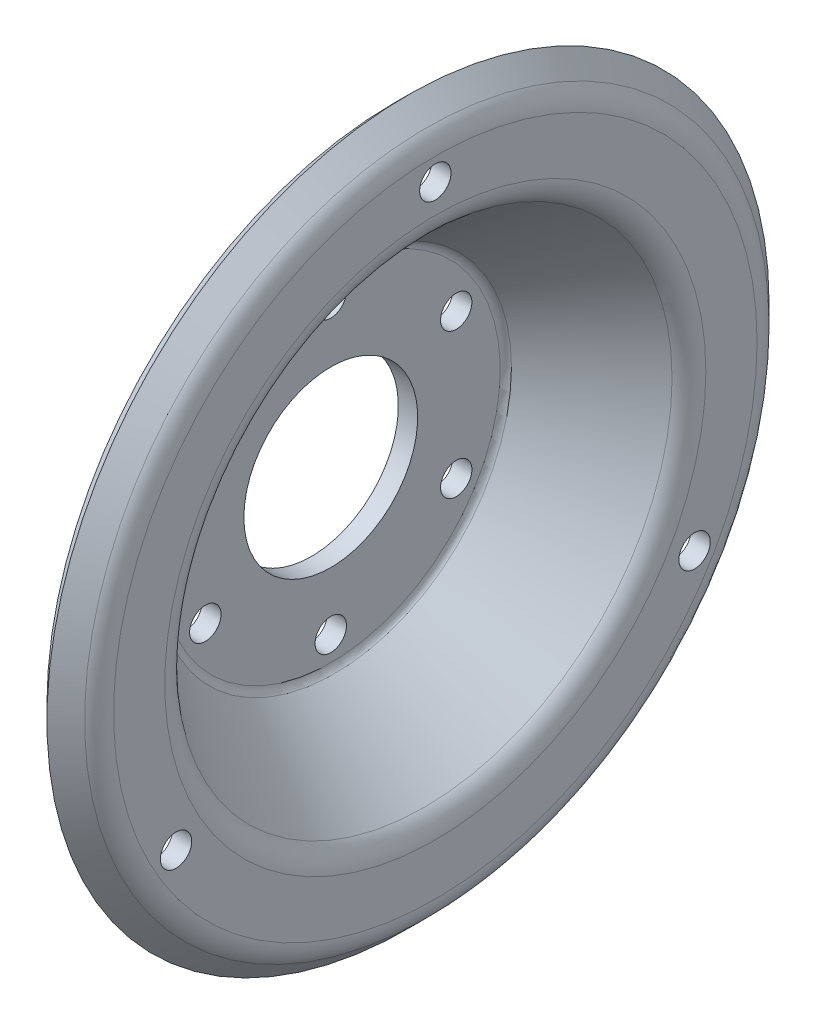
ISO-10303-21;
HEADER;
FILE_DESCRIPTION(('STEP AP214'),'2;1');
FILE_NAME('part.step','',(''),(''),'','','');
FILE_SCHEMA(('AUTOMOTIVE_DESIGN { 1 0 10303 214 1 1 1 1 }'));
ENDSEC;
DATA;
#1=APPLICATION_CONTEXT('core data for automotive mechanical design processes');
#2=APPLICATION_PROTOCOL_DEFINITION('international standard','automotive_design',2000,#1);
#3=PRODUCT_CONTEXT('',#1,'mechanical');
#4=PRODUCT('Part','Part','',(#3));
#5=PRODUCT_RELATED_PRODUCT_CATEGORY('part','',(#4));
#6=PRODUCT_DEFINITION_FORMATION('','',#4);
#7=PRODUCT_DEFINITION_CONTEXT('part definition',#1,'design');
#8=PRODUCT_DEFINITION('design','',#6,#7);
#9=PRODUCT_DEFINITION_SHAPE('','',#8);
#10=(LENGTH_UNIT() NAMED_UNIT(*) SI_UNIT(.MILLI.,.METRE.));
#11=(NAMED_UNIT(*) PLANE_ANGLE_UNIT() SI_UNIT($,.RADIAN.));
#12=(NAMED_UNIT(*) SI_UNIT($,.STERADIAN.) SOLID_ANGLE_UNIT());
#13=UNCERTAINTY_MEASURE_WITH_UNIT(LENGTH_MEASURE(1.E-05),#10,'distance_accuracy_value','');
#14=(GEOMETRIC_REPRESENTATION_CONTEXT(3) GLOBAL_UNCERTAINTY_ASSIGNED_CONTEXT((#13)) GLOBAL_UNIT_ASSIGNED_CONTEXT((#10,
#11,#12)) REPRESENTATION_CONTEXT('',''));
#15=CARTESIAN_POINT('',(0.,0.,0.));
#16=DIRECTION('',(0.,0.,1.));
#17=DIRECTION('',(1.,0.,0.));
#18=AXIS2_PLACEMENT_3D('',#15,#16,#17);
#19=CARTESIAN_POINT('',(4.76249999997251,0.,0.));
#20=DIRECTION('',(1.,0.,0.));
#21=DIRECTION('',(0.,1.,0.));
#22=AXIS2_PLACEMENT_3D('',#19,#20,#21);
#23=TOROIDAL_SURFACE('',#22,27.851971337,1.58749999995849);
#24=CARTESIAN_POINT('',(3.17500000001402,0.,0.));
#25=DIRECTION('',(1.,0.,0.));
#26=DIRECTION('',(0.,1.,0.));
#27=AXIS2_PLACEMENT_3D('',#24,#25,#26);
#28=CIRCLE('',#27,27.8519713231419);
#29=CARTESIAN_POINT('',(3.17500000001402,27.8519713231419,0.));
#30=VERTEX_POINT('',#29);
#31=EDGE_CURVE('E20',#30,#30,#28,.T.);
#32=ORIENTED_EDGE('',*,*,#31,.F.);
#33=EDGE_LOOP('',(#32));
#34=FACE_BOUND('',#33,.T.);
#35=CARTESIAN_POINT('',(3.77992162600005,0.,0.));
#36=DIRECTION('',(1.,0.,0.));
#37=DIRECTION('',(0.,0.,-1.));
#38=AXIS2_PLACEMENT_3D('',#35,#36,#37);
#39=CIRCLE('',#38,29.098845825);
#40=CARTESIAN_POINT('',(3.779921626,0.,-29.098845825));
#41=VERTEX_POINT('',#40);
#42=EDGE_CURVE('E90',#41,#41,#39,.F.);
#43=ORIENTED_EDGE('',*,*,#42,.F.);
#44=EDGE_LOOP('',(#43));
#45=FACE_BOUND('',#44,.T.);
#46=ADVANCED_FACE('F16',(#34,#45),#23,.F.);
#47=CARTESIAN_POINT('',(3.175,-28.186219608,28.186194993));
#48=DIRECTION('',(1.,0.,0.));
#49=DIRECTION('',(0.,0.,-1.));
#50=AXIS2_PLACEMENT_3D('',#47,#48,#49);
#51=PLANE('',#50);
#52=CARTESIAN_POINT('',(3.175,11.90625,20.622229928));
#53=DIRECTION('',(-1.,0.,0.));
#54=DIRECTION('',(0.,0.,1.));
#55=AXIS2_PLACEMENT_3D('',#52,#53,#54);
#56=CIRCLE('',#55,2.5781);
#57=CARTESIAN_POINT('',(3.175,11.90625,23.200329928));
#58=VERTEX_POINT('',#57);
#59=EDGE_CURVE('E89',#58,#58,#56,.F.);
#60=ORIENTED_EDGE('',*,*,#59,.F.);
#61=EDGE_LOOP('',(#60));
#62=FACE_BOUND('',#61,.T.);
#63=CARTESIAN_POINT('',(3.175,-11.90625,20.622229928));
#64=DIRECTION('',(-1.,0.,0.));
#65=DIRECTION('',(0.,0.,1.));
#66=AXIS2_PLACEMENT_3D('',#63,#64,#65);
#67=CIRCLE('',#66,2.5781);
#68=CARTESIAN_POINT('',(3.175,-11.90625,23.200329928));
#69=VERTEX_POINT('',#68);
#70=EDGE_CURVE('E164',#69,#69,#67,.F.);
#71=ORIENTED_EDGE('',*,*,#70,.F.);
#72=EDGE_LOOP('',(#71));
#73=FACE_BOUND('',#72,.T.);
#74=CARTESIAN_POINT('',(3.175,-23.8125,0.));
#75=DIRECTION('',(-1.,0.,0.));
#76=DIRECTION('',(0.,0.,1.));
#77=AXIS2_PLACEMENT_3D('',#74,#75,#76);
#78=CIRCLE('',#77,2.5781);
#79=CARTESIAN_POINT('',(3.175,-23.8125,2.5781));
#80=VERTEX_POINT('',#79);
#81=EDGE_CURVE('E167',#80,#80,#78,.F.);
#82=ORIENTED_EDGE('',*,*,#81,.F.);
#83=EDGE_LOOP('',(#82));
#84=FACE_BOUND('',#83,.T.);
#85=CARTESIAN_POINT('',(3.175,-11.90625,-20.622229928));
#86=DIRECTION('',(-1.,0.,0.));
#87=DIRECTION('',(0.,0.,1.));
#88=AXIS2_PLACEMENT_3D('',#85,#86,#87);
#89=CIRCLE('',#88,2.5781);
#90=CARTESIAN_POINT('',(3.175,-11.90625,-18.044129928));
#91=VERTEX_POINT('',#90);
#92=EDGE_CURVE('E170',#91,#91,#89,.F.);
#93=ORIENTED_EDGE('',*,*,#92,.F.);
#94=EDGE_LOOP('',(#93));
#95=FACE_BOUND('',#94,.T.);
#96=CARTESIAN_POINT('',(3.175,11.90625,-20.622229928));
#97=DIRECTION('',(-1.,0.,0.));
#98=DIRECTION('',(0.,0.,1.));
#99=AXIS2_PLACEMENT_3D('',#96,#97,#98);
#100=CIRCLE('',#99,2.5781);
#101=CARTESIAN_POINT('',(3.175,11.90625,-18.044129928));
#102=VERTEX_POINT('',#101);
#103=EDGE_CURVE('E173',#102,#102,#100,.F.);
#104=ORIENTED_EDGE('',*,*,#103,.F.);
#105=EDGE_LOOP('',(#104));
#106=FACE_BOUND('',#105,.T.);
#107=CARTESIAN_POINT('',(3.175,0.,0.));
#108=DIRECTION('',(-1.,0.,0.));
#109=DIRECTION('',(0.,0.,1.));
#110=AXIS2_PLACEMENT_3D('',#107,#108,#109);
#111=CIRCLE('',#110,14.2875);
#112=CARTESIAN_POINT('',(3.175,0.,14.2875));
#113=VERTEX_POINT('',#112);
#114=EDGE_CURVE('E176',#113,#113,#111,.F.);
#115=ORIENTED_EDGE('',*,*,#114,.F.);
#116=EDGE_LOOP('',(#115));
#117=FACE_BOUND('',#116,.T.);
#118=CARTESIAN_POINT('',(3.175,23.8125,0.));
#119=DIRECTION('',(-1.,0.,0.));
#120=DIRECTION('',(0.,0.,1.));
#121=AXIS2_PLACEMENT_3D('',#118,#119,#120);
#122=CIRCLE('',#121,2.5781);
#123=CARTESIAN_POINT('',(3.175,23.8125,2.5781));
#124=VERTEX_POINT('',#123);
#125=EDGE_CURVE('E92',#124,#124,#122,.F.);
#126=ORIENTED_EDGE('',*,*,#125,.F.);
#127=EDGE_LOOP('',(#126));
#128=FACE_BOUND('',#127,.T.);
#129=ORIENTED_EDGE('',*,*,#31,.T.);
#130=EDGE_LOOP('',(#129));
#131=FACE_BOUND('',#130,.T.);
#132=ADVANCED_FACE('F184',(#62,#73,#84,#95,#106,#117,#128,#131),#51,.T.);
#133=CARTESIAN_POINT('',(18.964466045,0.,0.));
#134=DIRECTION('',(-1.,0.,0.));
#135=DIRECTION('',(0.,0.,1.));
#136=AXIS2_PLACEMENT_3D('',#133,#134,#135);
#137=CONICAL_SURFACE('',#136,56.258903955,0.785398163397447);
#138=CARTESIAN_POINT('',(18.964466045,0.,0.));
#139=DIRECTION('',(1.,0.,0.));
#140=DIRECTION('',(0.,0.,-1.));
#141=AXIS2_PLACEMENT_3D('',#138,#139,#140);
#142=CIRCLE('',#141,56.258903955);
#143=CARTESIAN_POINT('',(18.964466045,0.,-56.258903955));
#144=VERTEX_POINT('',#143);
#145=EDGE_CURVE('E83',#144,#144,#142,.T.);
#146=ORIENTED_EDGE('',*,*,#145,.F.);
#147=EDGE_LOOP('',(#146));
#148=FACE_BOUND('',#147,.T.);
#149=CARTESIAN_POINT('',(15.869241939,0.,0.));
#150=DIRECTION('',(1.,0.,0.));
#151=DIRECTION('',(0.,0.,-1.));
#152=AXIS2_PLACEMENT_3D('',#149,#150,#151);
#153=CIRCLE('',#152,59.354128061);
#154=CARTESIAN_POINT('',(15.869241939,0.,-59.354128061));
#155=VERTEX_POINT('',#154);
#156=EDGE_CURVE('E86',#155,#155,#153,.T.);
#157=ORIENTED_EDGE('',*,*,#156,.T.);
#158=EDGE_LOOP('',(#157));
#159=FACE_BOUND('',#158,.T.);
#160=ADVANCED_FACE('F187',(#148,#159),#137,.T.);
#161=CARTESIAN_POINT('',(3.779921626,0.,0.));
#162=DIRECTION('',(1.,0.,0.));
#163=DIRECTION('',(0.,1.,0.));
#164=AXIS2_PLACEMENT_3D('',#161,#162,#163);
#165=CONICAL_SURFACE('',#164,29.098845825,0.667401340824713);
#166=ORIENTED_EDGE('',*,*,#42,.T.);
#167=EDGE_LOOP('',(#166));
#168=FACE_BOUND('',#167,.T.);
#169=CARTESIAN_POINT('',(18.544605122,0.,0.));
#170=DIRECTION('',(-1.,0.,0.));
#171=DIRECTION('',(0.,0.,1.));
#172=AXIS2_PLACEMENT_3D('',#169,#170,#171);
#173=CIRCLE('',#172,40.733905199);
#174=CARTESIAN_POINT('',(18.544605122,0.,40.733905199));
#175=VERTEX_POINT('',#174);
#176=EDGE_CURVE('E79',#175,#175,#173,.T.);
#177=ORIENTED_EDGE('',*,*,#176,.F.);
#178=EDGE_LOOP('',(#177));
#179=FACE_BOUND('',#178,.T.);
#180=ADVANCED_FACE('F198',(#168,#179),#165,.F.);
#181=CARTESIAN_POINT('',(3.175,23.8125,0.));
#182=DIRECTION('',(-1.,0.,0.));
#183=DIRECTION('',(0.,0.,1.));
#184=AXIS2_PLACEMENT_3D('',#181,#182,#183);
#185=CYLINDRICAL_SURFACE('',#184,2.5781);
#186=ORIENTED_EDGE('',*,*,#125,.T.);
#187=EDGE_LOOP('',(#186));
#188=FACE_BOUND('',#187,.T.);
#189=CARTESIAN_POINT('',(0.,23.8125,0.));
#190=DIRECTION('',(-1.,0.,0.));
#191=DIRECTION('',(0.,0.,1.));
#192=AXIS2_PLACEMENT_3D('',#189,#190,#191);
#193=CIRCLE('',#192,2.5781);
#194=CARTESIAN_POINT('',(0.,23.8125,2.5781));
#195=VERTEX_POINT('',#194);
#196=EDGE_CURVE('E82',#195,#195,#193,.F.);
#197=ORIENTED_EDGE('',*,*,#196,.F.);
#198=EDGE_LOOP('',(#197));
#199=FACE_BOUND('',#198,.T.);
#200=ADVANCED_FACE('F181',(#188,#199),#185,.F.);
#201=CARTESIAN_POINT('',(3.175,0.,0.));
#202=DIRECTION('',(-1.,0.,0.));
#203=DIRECTION('',(0.,0.,1.));
#204=AXIS2_PLACEMENT_3D('',#201,#202,#203);
#205=CYLINDRICAL_SURFACE('',#204,14.2875);
#206=ORIENTED_EDGE('',*,*,#114,.T.);
#207=EDGE_LOOP('',(#206));
#208=FACE_BOUND('',#207,.T.);
#209=CARTESIAN_POINT('',(0.,0.,0.));
#210=DIRECTION('',(-1.,0.,0.));
#211=DIRECTION('',(0.,0.,1.));
#212=AXIS2_PLACEMENT_3D('',#209,#210,#211);
#213=CIRCLE('',#212,14.2875);
#214=CARTESIAN_POINT('',(0.,0.,14.2875));
#215=VERTEX_POINT('',#214);
#216=EDGE_CURVE('E157',#215,#215,#213,.F.);
#217=ORIENTED_EDGE('',*,*,#216,.F.);
#218=EDGE_LOOP('',(#217));
#219=FACE_BOUND('',#218,.T.);
#220=ADVANCED_FACE('F286',(#208,#219),#205,.F.);
#221=CARTESIAN_POINT('',(3.175,11.90625,-20.622229928));
#222=DIRECTION('',(-1.,0.,0.));
#223=DIRECTION('',(0.,0.,1.));
#224=AXIS2_PLACEMENT_3D('',#221,#222,#223);
#225=CYLINDRICAL_SURFACE('',#224,2.5781);
#226=ORIENTED_EDGE('',*,*,#103,.T.);
#227=EDGE_LOOP('',(#226));
#228=FACE_BOUND('',#227,.T.);
#229=CARTESIAN_POINT('',(0.,11.90625,-20.622229928));
#230=DIRECTION('',(-1.,0.,0.));
#231=DIRECTION('',(0.,0.,1.));
#232=AXIS2_PLACEMENT_3D('',#229,#230,#231);
#233=CIRCLE('',#232,2.5781);
#234=CARTESIAN_POINT('',(0.,11.90625,-18.044129928));
#235=VERTEX_POINT('',#234);
#236=EDGE_CURVE('E154',#235,#235,#233,.F.);
#237=ORIENTED_EDGE('',*,*,#236,.F.);
#238=EDGE_LOOP('',(#237));
#239=FACE_BOUND('',#238,.T.);
#240=ADVANCED_FACE('F282',(#228,#239),#225,.F.);
#241=CARTESIAN_POINT('',(3.175,-11.90625,-20.622229928));
#242=DIRECTION('',(-1.,0.,0.));
#243=DIRECTION('',(0.,0.,1.));
#244=AXIS2_PLACEMENT_3D('',#241,#242,#243);
#245=CYLINDRICAL_SURFACE('',#244,2.5781);
#246=ORIENTED_EDGE('',*,*,#92,.T.);
#247=EDGE_LOOP('',(#246));
#248=FACE_BOUND('',#247,.T.);
#249=CARTESIAN_POINT('',(0.,-11.90625,-20.622229928));
#250=DIRECTION('',(-1.,0.,0.));
#251=DIRECTION('',(0.,0.,1.));
#252=AXIS2_PLACEMENT_3D('',#249,#250,#251);
#253=CIRCLE('',#252,2.5781);
#254=CARTESIAN_POINT('',(0.,-11.90625,-18.044129928));
#255=VERTEX_POINT('',#254);
#256=EDGE_CURVE('E151',#255,#255,#253,.F.);
#257=ORIENTED_EDGE('',*,*,#256,.F.);
#258=EDGE_LOOP('',(#257));
#259=FACE_BOUND('',#258,.T.);
#260=ADVANCED_FACE('F278',(#248,#259),#245,.F.);
#261=CARTESIAN_POINT('',(3.175,-23.8125,0.));
#262=DIRECTION('',(-1.,0.,0.));
#263=DIRECTION('',(0.,0.,1.));
#264=AXIS2_PLACEMENT_3D('',#261,#262,#263);
#265=CYLINDRICAL_SURFACE('',#264,2.5781);
#266=ORIENTED_EDGE('',*,*,#81,.T.);
#267=EDGE_LOOP('',(#266));
#268=FACE_BOUND('',#267,.T.);
#269=CARTESIAN_POINT('',(0.,-23.8125,0.));
#270=DIRECTION('',(-1.,0.,0.));
#271=DIRECTION('',(0.,0.,1.));
#272=AXIS2_PLACEMENT_3D('',#269,#270,#271);
#273=CIRCLE('',#272,2.5781);
#274=CARTESIAN_POINT('',(0.,-23.8125,2.5781));
#275=VERTEX_POINT('',#274);
#276=EDGE_CURVE('E148',#275,#275,#273,.F.);
#277=ORIENTED_EDGE('',*,*,#276,.F.);
#278=EDGE_LOOP('',(#277));
#279=FACE_BOUND('',#278,.T.);
#280=ADVANCED_FACE('F274',(#268,#279),#265,.F.);
#281=CARTESIAN_POINT('',(3.175,-11.90625,20.622229928));
#282=DIRECTION('',(-1.,0.,0.));
#283=DIRECTION('',(0.,0.,1.));
#284=AXIS2_PLACEMENT_3D('',#281,#282,#283);
#285=CYLINDRICAL_SURFACE('',#284,2.5781);
#286=ORIENTED_EDGE('',*,*,#70,.T.);
#287=EDGE_LOOP('',(#286));
#288=FACE_BOUND('',#287,.T.);
#289=CARTESIAN_POINT('',(0.,-11.90625,20.622229928));
#290=DIRECTION('',(-1.,0.,0.));
#291=DIRECTION('',(0.,0.,1.));
#292=AXIS2_PLACEMENT_3D('',#289,#290,#291);
#293=CIRCLE('',#292,2.5781);
#294=CARTESIAN_POINT('',(0.,-11.90625,23.200329928));
#295=VERTEX_POINT('',#294);
#296=EDGE_CURVE('E145',#295,#295,#293,.F.);
#297=ORIENTED_EDGE('',*,*,#296,.F.);
#298=EDGE_LOOP('',(#297));
#299=FACE_BOUND('',#298,.T.);
#300=ADVANCED_FACE('F270',(#288,#299),#285,.F.);
#301=CARTESIAN_POINT('',(3.175,11.90625,20.622229928));
#302=DIRECTION('',(-1.,0.,0.));
#303=DIRECTION('',(0.,0.,1.));
#304=AXIS2_PLACEMENT_3D('',#301,#302,#303);
#305=CYLINDRICAL_SURFACE('',#304,2.5781);
#306=ORIENTED_EDGE('',*,*,#59,.T.);
#307=EDGE_LOOP('',(#306));
#308=FACE_BOUND('',#307,.T.);
#309=CARTESIAN_POINT('',(0.,11.90625,20.622229928));
#310=DIRECTION('',(-1.,0.,0.));
#311=DIRECTION('',(0.,0.,1.));
#312=AXIS2_PLACEMENT_3D('',#309,#310,#311);
#313=CIRCLE('',#312,2.5781);
#314=CARTESIAN_POINT('',(0.,11.90625,23.200329928));
#315=VERTEX_POINT('',#314);
#316=EDGE_CURVE('E78',#315,#315,#313,.F.);
#317=ORIENTED_EDGE('',*,*,#316,.F.);
#318=EDGE_LOOP('',(#317));
#319=FACE_BOUND('',#318,.T.);
#320=ADVANCED_FACE('F226',(#308,#319),#305,.F.);
#321=CARTESIAN_POINT('',(13.624177909,0.,0.));
#322=DIRECTION('',(1.,0.,0.));
#323=DIRECTION('',(0.,0.,-1.));
#324=AXIS2_PLACEMENT_3D('',#321,#322,#323);
#325=CONICAL_SURFACE('',#324,57.10906403,0.785398163620155);
#326=CARTESIAN_POINT('',(13.6241779090001,0.,0.));
#327=DIRECTION('',(-1.,0.,0.));
#328=DIRECTION('',(0.,0.,1.));
#329=AXIS2_PLACEMENT_3D('',#326,#327,#328);
#330=CIRCLE('',#329,57.10906403);
#331=CARTESIAN_POINT('',(13.624177909,0.,57.10906403));
#332=VERTEX_POINT('',#331);
#333=EDGE_CURVE('E74',#332,#332,#330,.T.);
#334=ORIENTED_EDGE('',*,*,#333,.F.);
#335=EDGE_LOOP('',(#334));
#336=FACE_BOUND('',#335,.T.);
#337=ORIENTED_EDGE('',*,*,#156,.F.);
#338=EDGE_LOOP('',(#337));
#339=FACE_BOUND('',#338,.T.);
#340=ADVANCED_FACE('F219',(#336,#339),#325,.T.);
#341=CARTESIAN_POINT('',(15.596869999,0.,0.));
#342=DIRECTION('',(1.,0.,0.));
#343=DIRECTION('',(0.,0.,-1.));
#344=AXIS2_PLACEMENT_3D('',#341,#342,#343);
#345=TOROIDAL_SURFACE('',#344,52.891307909,4.76250000092363);
#346=ORIENTED_EDGE('',*,*,#145,.T.);
#347=EDGE_LOOP('',(#346));
#348=FACE_BOUND('',#347,.T.);
#349=CARTESIAN_POINT('',(20.3593699999236,0.,0.));
#350=DIRECTION('',(1.,0.,0.));
#351=DIRECTION('',(0.,0.,-1.));
#352=AXIS2_PLACEMENT_3D('',#349,#350,#351);
#353=CIRCLE('',#352,52.8913078828568);
#354=CARTESIAN_POINT('',(20.3593699999236,0.,-52.8913078828568));
#355=VERTEX_POINT('',#354);
#356=EDGE_CURVE('E77',#355,#355,#353,.T.);
#357=ORIENTED_EDGE('',*,*,#356,.F.);
#358=EDGE_LOOP('',(#357));
#359=FACE_BOUND('',#358,.T.);
#360=ADVANCED_FACE('F208',(#348,#359),#345,.T.);
#361=CARTESIAN_POINT('',(15.5968700000825,0.,0.));
#362=DIRECTION('',(1.,0.,0.));
#363=DIRECTION('',(0.,0.,-1.));
#364=AXIS2_PLACEMENT_3D('',#361,#362,#363);
#365=TOROIDAL_SURFACE('',#364,44.474528663,4.76249999987547);
#366=ORIENTED_EDGE('',*,*,#176,.T.);
#367=EDGE_LOOP('',(#366));
#368=FACE_BOUND('',#367,.T.);
#369=CARTESIAN_POINT('',(20.359369999958,0.,0.));
#370=DIRECTION('',(1.,0.,0.));
#371=DIRECTION('',(0.,0.,-1.));
#372=AXIS2_PLACEMENT_3D('',#369,#370,#371);
#373=CIRCLE('',#372,44.4745286949443);
#374=CARTESIAN_POINT('',(20.359369999958,0.,-44.4745286949443));
#375=VERTEX_POINT('',#374);
#376=EDGE_CURVE('E138',#375,#375,#373,.F.);
#377=ORIENTED_EDGE('',*,*,#376,.F.);
#378=EDGE_LOOP('',(#377));
#379=FACE_BOUND('',#378,.T.);
#380=ADVANCED_FACE('F204',(#368,#379),#365,.T.);
#381=CARTESIAN_POINT('',(0.,-28.186219608,-28.186194993));
#382=DIRECTION('',(-1.,0.,0.));
#383=DIRECTION('',(0.,0.,1.));
#384=AXIS2_PLACEMENT_3D('',#381,#382,#383);
#385=PLANE('',#384);
#386=ORIENTED_EDGE('',*,*,#316,.T.);
#387=EDGE_LOOP('',(#386));
#388=FACE_BOUND('',#387,.T.);
#389=ORIENTED_EDGE('',*,*,#296,.T.);
#390=EDGE_LOOP('',(#389));
#391=FACE_BOUND('',#390,.T.);
#392=ORIENTED_EDGE('',*,*,#276,.T.);
#393=EDGE_LOOP('',(#392));
#394=FACE_BOUND('',#393,.T.);
#395=ORIENTED_EDGE('',*,*,#256,.T.);
#396=EDGE_LOOP('',(#395));
#397=FACE_BOUND('',#396,.T.);
#398=ORIENTED_EDGE('',*,*,#236,.T.);
#399=EDGE_LOOP('',(#398));
#400=FACE_BOUND('',#399,.T.);
#401=ORIENTED_EDGE('',*,*,#216,.T.);
#402=EDGE_LOOP('',(#401));
#403=FACE_BOUND('',#402,.T.);
#404=ORIENTED_EDGE('',*,*,#196,.T.);
#405=EDGE_LOOP('',(#404));
#406=FACE_BOUND('',#405,.T.);
#407=CARTESIAN_POINT('',(4.20392887168219E-11,0.,0.));
#408=DIRECTION('',(-1.,0.,0.));
#409=DIRECTION('',(0.,0.,1.));
#410=AXIS2_PLACEMENT_3D('',#407,#408,#409);
#411=CIRCLE('',#410,27.851971337);
#412=CARTESIAN_POINT('',(4.20392887168219E-11,0.,27.851971337));
#413=VERTEX_POINT('',#412);
#414=EDGE_CURVE('E53',#413,#413,#411,.F.);
#415=ORIENTED_EDGE('',*,*,#414,.F.);
#416=EDGE_LOOP('',(#415));
#417=FACE_BOUND('',#416,.T.);
#418=ADVANCED_FACE('F207',(#388,#391,#394,#397,#400,#403,#406,#417),#385,.T.);
#419=CARTESIAN_POINT('',(16.719402015,0.,0.));
#420=DIRECTION('',(-1.,0.,0.));
#421=DIRECTION('',(0.,-1.,0.));
#422=AXIS2_PLACEMENT_3D('',#419,#420,#421);
#423=CONICAL_SURFACE('',#422,54.013839924,0.785398163397448);
#424=ORIENTED_EDGE('',*,*,#333,.T.);
#425=EDGE_LOOP('',(#424));
#426=FACE_BOUND('',#425,.T.);
#427=CARTESIAN_POINT('',(16.719402015,0.,0.));
#428=DIRECTION('',(1.,0.,0.));
#429=DIRECTION('',(0.,0.,-1.));
#430=AXIS2_PLACEMENT_3D('',#427,#428,#429);
#431=CIRCLE('',#430,54.013839924);
#432=CARTESIAN_POINT('',(16.719402015,-2.42504933607236E-09,54.013839924));
#433=VERTEX_POINT('',#432);
#434=CARTESIAN_POINT('',(16.719402015,-5.53921187784534E-09,-54.013839924));
#435=VERTEX_POINT('',#434);
#436=EDGE_CURVE('E57',#433,#435,#431,.T.);
#437=ORIENTED_EDGE('',*,*,#436,.T.);
#438=CARTESIAN_POINT('',(16.719402015,0.,0.));
#439=DIRECTION('',(1.,0.,0.));
#440=DIRECTION('',(0.,0.,-1.));
#441=AXIS2_PLACEMENT_3D('',#438,#439,#440);
#442=CIRCLE('',#441,54.013839924);
#443=EDGE_CURVE('E44',#435,#433,#442,.T.);
#444=ORIENTED_EDGE('',*,*,#443,.T.);
#445=EDGE_LOOP('',(#437,#444));
#446=FACE_BOUND('',#445,.T.);
#447=ADVANCED_FACE('F62',(#426,#446),#423,.F.);
#448=CARTESIAN_POINT('',(20.35937,-53.526028222,53.526003604));
#449=DIRECTION('',(1.,0.,0.));
#450=DIRECTION('',(0.,0.,-1.));
#451=AXIS2_PLACEMENT_3D('',#448,#449,#450);
#452=PLANE('',#451);
#453=CARTESIAN_POINT('',(20.35937,-24.60625,-42.619275184));
#454=DIRECTION('',(1.,0.,0.));
#455=DIRECTION('',(0.,1.,0.));
#456=AXIS2_PLACEMENT_3D('',#453,#454,#455);
#457=CIRCLE('',#456,2.57810000000001);
#458=CARTESIAN_POINT('',(20.35937,-22.02815,-42.619275184));
#459=VERTEX_POINT('',#458);
#460=EDGE_CURVE('E73',#459,#459,#457,.T.);
#461=ORIENTED_EDGE('',*,*,#460,.F.);
#462=EDGE_LOOP('',(#461));
#463=FACE_BOUND('',#462,.T.);
#464=CARTESIAN_POINT('',(20.35937,-24.60625,42.619275184));
#465=DIRECTION('',(1.,0.,0.));
#466=DIRECTION('',(0.,1.,0.));
#467=AXIS2_PLACEMENT_3D('',#464,#465,#466);
#468=CIRCLE('',#467,2.5781);
#469=CARTESIAN_POINT('',(20.35937,-22.02815,42.619275184));
#470=VERTEX_POINT('',#469);
#471=EDGE_CURVE('E131',#470,#470,#468,.T.);
#472=ORIENTED_EDGE('',*,*,#471,.F.);
#473=EDGE_LOOP('',(#472));
#474=FACE_BOUND('',#473,.T.);
#475=CARTESIAN_POINT('',(20.35937,49.2125,0.));
#476=DIRECTION('',(1.,0.,0.));
#477=DIRECTION('',(0.,1.,0.));
#478=AXIS2_PLACEMENT_3D('',#475,#476,#477);
#479=CIRCLE('',#478,2.5781);
#480=CARTESIAN_POINT('',(20.35937,51.7906,0.));
#481=VERTEX_POINT('',#480);
#482=EDGE_CURVE('E60',#481,#481,#479,.T.);
#483=ORIENTED_EDGE('',*,*,#482,.F.);
#484=EDGE_LOOP('',(#483));
#485=FACE_BOUND('',#484,.T.);
#486=ORIENTED_EDGE('',*,*,#376,.T.);
#487=EDGE_LOOP('',(#486));
#488=FACE_BOUND('',#487,.T.);
#489=ORIENTED_EDGE('',*,*,#356,.T.);
#490=EDGE_LOOP('',(#489));
#491=FACE_BOUND('',#490,.T.);
#492=ADVANCED_FACE('F212',(#463,#474,#485,#488,#491),#452,.T.);
#493=CARTESIAN_POINT('',(4.76249999991748,0.,0.));
#494=DIRECTION('',(-1.,0.,0.));
#495=DIRECTION('',(0.,0.,1.));
#496=AXIS2_PLACEMENT_3D('',#493,#494,#495);
#497=TOROIDAL_SURFACE('',#496,27.851971337,4.76249999987544);
#498=ORIENTED_EDGE('',*,*,#414,.T.);
#499=EDGE_LOOP('',(#498));
#500=FACE_BOUND('',#499,.T.);
#501=CARTESIAN_POINT('',(1.81476487800003,0.,0.));
#502=DIRECTION('',(1.,0.,0.));
#503=DIRECTION('',(0.,0.,-1.));
#504=AXIS2_PLACEMENT_3D('',#501,#502,#503);
#505=CIRCLE('',#504,31.592594801);
#506=CARTESIAN_POINT('',(1.814764878,0.,-31.592594801));
#507=VERTEX_POINT('',#506);
#508=EDGE_CURVE('E70',#507,#507,#505,.F.);
#509=ORIENTED_EDGE('',*,*,#508,.T.);
#510=EDGE_LOOP('',(#509));
#511=FACE_BOUND('',#510,.T.);
#512=ADVANCED_FACE('F109',(#500,#511),#497,.T.);
#513=CARTESIAN_POINT('',(16.719402015,0.,54.013839924));
#514=CARTESIAN_POINT('',(16.719402015,108.027679849,54.013839924));
#515=CARTESIAN_POINT('',(16.719402015,108.027679849,-54.013839924));
#516=CARTESIAN_POINT('',(16.719402015,0.,-54.013839924));
#517=CARTESIAN_POINT('',(17.021094957,0.,53.712146983));
#518=CARTESIAN_POINT('',(17.021094957,107.424293966,53.712146983));
#519=CARTESIAN_POINT('',(17.021094957,107.424293966,-53.712146983));
#520=CARTESIAN_POINT('',(17.021094957,0.,-53.712146983));
#521=CARTESIAN_POINT('',(17.18437,0.,53.317966159));
#522=CARTESIAN_POINT('',(17.18437,106.635932317,53.317966159));
#523=CARTESIAN_POINT('',(17.18437,106.635932317,-53.317966159));
#524=CARTESIAN_POINT('',(17.18437,0.,-53.317966159));
#525=CARTESIAN_POINT('',(17.18437,0.,52.891307909));
#526=CARTESIAN_POINT('',(17.18437,105.782615818,52.891307909));
#527=CARTESIAN_POINT('',(17.18437,105.782615818,-52.891307909));
#528=CARTESIAN_POINT('',(17.18437,0.,-52.891307909));
#529=(BOUNDED_SURFACE() B_SPLINE_SURFACE(3,3,((#513,#514,#515,#516),(#517,#518,#519,#520),(#521,
#522,#523,#524),(#525,#526,#527,#528)),.UNSPECIFIED.,.F.,.F.,
.F.) B_SPLINE_SURFACE_WITH_KNOTS((4,4),(4,4),(0.,1.),(0.,1.),
.UNSPECIFIED.) GEOMETRIC_REPRESENTATION_ITEM() RATIONAL_B_SPLINE_SURFACE(((1.,0.333333333333333,
0.333333333333333,1.),(0.949253021674184,0.316417673891395,0.316417673891395,0.949253021674184),
(0.949253021674184,0.316417673891395,0.316417673891395,0.949253021674184),(1.,0.333333333333333,
0.333333333333333,1.))) REPRESENTATION_ITEM('') SURFACE());
#530=CARTESIAN_POINT('',(16.719402015,0.,-54.013839924));
#531=CARTESIAN_POINT('',(17.021094957,0.,-53.712146983));
#532=CARTESIAN_POINT('',(17.18437,0.,-53.317966159));
#533=CARTESIAN_POINT('',(17.18437,0.,-52.891307909));
#534=(BOUNDED_CURVE() B_SPLINE_CURVE(3,(#530,#531,#532,#533),.UNSPECIFIED.,.F.,
.F.) B_SPLINE_CURVE_WITH_KNOTS((4,4),(0.,1.),
.UNSPECIFIED.) CURVE() GEOMETRIC_REPRESENTATION_ITEM() RATIONAL_B_SPLINE_CURVE((1.,
0.949253021674184,0.949253021674184,1.)) REPRESENTATION_ITEM(''));
#535=CARTESIAN_POINT('',(17.18437,0.,-52.8913078985427));
#536=VERTEX_POINT('',#535);
#537=EDGE_CURVE('E50',#435,#536,#534,.T.);
#538=CARTESIAN_POINT('',(17.18437,0.,-52.891307909));
#539=CARTESIAN_POINT('',(17.18437,105.782615818,-52.891307909));
#540=CARTESIAN_POINT('',(17.18437,105.782615818,52.891307909));
#541=CARTESIAN_POINT('',(17.18437,0.,52.891307909));
#542=(BOUNDED_CURVE() B_SPLINE_CURVE(3,(#538,#539,#540,#541),.UNSPECIFIED.,.F.,
.F.) B_SPLINE_CURVE_WITH_KNOTS((4,4),(0.,1.),
.UNSPECIFIED.) CURVE() GEOMETRIC_REPRESENTATION_ITEM() RATIONAL_B_SPLINE_CURVE((0.999999999999998,
0.333333333333332,0.333333333333332,0.999999999999998)) REPRESENTATION_ITEM(''));
#543=CARTESIAN_POINT('',(17.18437,0.,52.8913078985427));
#544=VERTEX_POINT('',#543);
#545=EDGE_CURVE('E34',#544,#536,#542,.F.);
#546=CARTESIAN_POINT('',(16.719402015,0.,54.013839924));
#547=CARTESIAN_POINT('',(17.021094957,0.,53.712146983));
#548=CARTESIAN_POINT('',(17.18437,0.,53.317966159));
#549=CARTESIAN_POINT('',(17.18437,0.,52.891307909));
#550=(BOUNDED_CURVE() B_SPLINE_CURVE(3,(#546,#547,#548,#549),.UNSPECIFIED.,.F.,
.F.) B_SPLINE_CURVE_WITH_KNOTS((4,4),(0.,1.),
.UNSPECIFIED.) CURVE() GEOMETRIC_REPRESENTATION_ITEM() RATIONAL_B_SPLINE_CURVE((1.,
0.949253021674184,0.949253021674184,1.)) REPRESENTATION_ITEM(''));
#551=EDGE_CURVE('E52',#544,#433,#550,.F.);
#552=ORIENTED_EDGE('',*,*,#537,.T.);
#553=ORIENTED_EDGE('',*,*,#545,.F.);
#554=ORIENTED_EDGE('',*,*,#551,.T.);
#555=ORIENTED_EDGE('',*,*,#443,.F.);
#556=EDGE_LOOP('',(#552,#553,#554,#555));
#557=FACE_BOUND('',#556,.T.);
#558=ADVANCED_FACE('F49',(#557),#529,.F.);
#559=CARTESIAN_POINT('',(16.719402015,0.,-54.013839924));
#560=CARTESIAN_POINT('',(16.719402015,-108.027679849,-54.013839924));
#561=CARTESIAN_POINT('',(16.719402015,-108.027679849,54.013839924));
#562=CARTESIAN_POINT('',(16.719402015,0.,54.013839924));
#563=CARTESIAN_POINT('',(17.021094957,0.,-53.712146983));
#564=CARTESIAN_POINT('',(17.021094957,-107.424293966,-53.712146983));
#565=CARTESIAN_POINT('',(17.021094957,-107.424293966,53.712146983));
#566=CARTESIAN_POINT('',(17.021094957,0.,53.712146983));
#567=CARTESIAN_POINT('',(17.18437,0.,-53.317966159));
#568=CARTESIAN_POINT('',(17.18437,-106.635932317,-53.317966159));
#569=CARTESIAN_POINT('',(17.18437,-106.635932317,53.317966159));
#570=CARTESIAN_POINT('',(17.18437,0.,53.317966159));
#571=CARTESIAN_POINT('',(17.18437,0.,-52.891307909));
#572=CARTESIAN_POINT('',(17.18437,-105.782615818,-52.891307909));
#573=CARTESIAN_POINT('',(17.18437,-105.782615818,52.891307909));
#574=CARTESIAN_POINT('',(17.18437,0.,52.891307909));
#575=(BOUNDED_SURFACE() B_SPLINE_SURFACE(3,3,((#559,#560,#561,#562),(#563,#564,#565,#566),(#567,
#568,#569,#570),(#571,#572,#573,#574)),.UNSPECIFIED.,.F.,.F.,
.F.) B_SPLINE_SURFACE_WITH_KNOTS((4,4),(4,4),(0.,1.),(0.,1.),
.UNSPECIFIED.) GEOMETRIC_REPRESENTATION_ITEM() RATIONAL_B_SPLINE_SURFACE(((1.,0.333333333333333,
0.333333333333333,1.),(0.949253021674184,0.316417673891395,0.316417673891395,0.949253021674184),
(0.949253021674184,0.316417673891395,0.316417673891395,0.949253021674184),(1.,0.333333333333333,
0.333333333333333,1.))) REPRESENTATION_ITEM('') SURFACE());
#576=CARTESIAN_POINT('',(17.18437,0.,52.891307909));
#577=CARTESIAN_POINT('',(17.18437,-105.782615818,52.891307909));
#578=CARTESIAN_POINT('',(17.18437,-105.782615818,-52.891307909));
#579=CARTESIAN_POINT('',(17.18437,0.,-52.891307909));
#580=(BOUNDED_CURVE() B_SPLINE_CURVE(3,(#576,#577,#578,#579),.UNSPECIFIED.,.F.,
.F.) B_SPLINE_CURVE_WITH_KNOTS((4,4),(0.,1.),
.UNSPECIFIED.) CURVE() GEOMETRIC_REPRESENTATION_ITEM() RATIONAL_B_SPLINE_CURVE((0.999999999999998,
0.333333333333332,0.333333333333332,0.999999999999998)) REPRESENTATION_ITEM(''));
#581=EDGE_CURVE('E58',#536,#544,#580,.F.);
#582=ORIENTED_EDGE('',*,*,#436,.F.);
#583=ORIENTED_EDGE('',*,*,#551,.F.);
#584=ORIENTED_EDGE('',*,*,#581,.F.);
#585=ORIENTED_EDGE('',*,*,#537,.F.);
#586=EDGE_LOOP('',(#582,#583,#584,#585));
#587=FACE_BOUND('',#586,.T.);
#588=ADVANCED_FACE('F56',(#587),#575,.F.);
#589=CARTESIAN_POINT('',(17.18437,49.2125,0.));
#590=DIRECTION('',(1.,0.,0.));
#591=DIRECTION('',(0.,1.,0.));
#592=AXIS2_PLACEMENT_3D('',#589,#590,#591);
#593=CYLINDRICAL_SURFACE('',#592,2.5781);
#594=ORIENTED_EDGE('',*,*,#482,.T.);
#595=EDGE_LOOP('',(#594));
#596=FACE_BOUND('',#595,.T.);
#597=CARTESIAN_POINT('',(17.18437,49.2125,0.));
#598=DIRECTION('',(1.,0.,0.));
#599=DIRECTION('',(0.,1.,0.));
#600=AXIS2_PLACEMENT_3D('',#597,#598,#599);
#601=CIRCLE('',#600,2.5781);
#602=CARTESIAN_POINT('',(17.18437,51.7906,0.));
#603=VERTEX_POINT('',#602);
#604=EDGE_CURVE('E126',#603,#603,#601,.T.);
#605=ORIENTED_EDGE('',*,*,#604,.F.);
#606=EDGE_LOOP('',(#605));
#607=FACE_BOUND('',#606,.T.);
#608=ADVANCED_FACE('F398',(#596,#607),#593,.F.);
#609=CARTESIAN_POINT('',(17.18437,-24.60625,42.619275184));
#610=DIRECTION('',(1.,0.,0.));
#611=DIRECTION('',(0.,1.,0.));
#612=AXIS2_PLACEMENT_3D('',#609,#610,#611);
#613=CYLINDRICAL_SURFACE('',#612,2.5781);
#614=ORIENTED_EDGE('',*,*,#471,.T.);
#615=EDGE_LOOP('',(#614));
#616=FACE_BOUND('',#615,.T.);
#617=CARTESIAN_POINT('',(17.18437,-24.60625,42.619275184));
#618=DIRECTION('',(1.,0.,0.));
#619=DIRECTION('',(0.,1.,0.));
#620=AXIS2_PLACEMENT_3D('',#617,#618,#619);
#621=CIRCLE('',#620,2.5781);
#622=CARTESIAN_POINT('',(17.18437,-22.02815,42.619275184));
#623=VERTEX_POINT('',#622);
#624=EDGE_CURVE('E123',#623,#623,#621,.T.);
#625=ORIENTED_EDGE('',*,*,#624,.F.);
#626=EDGE_LOOP('',(#625));
#627=FACE_BOUND('',#626,.T.);
#628=ADVANCED_FACE('F406',(#616,#627),#613,.F.);
#629=CARTESIAN_POINT('',(17.18437,-24.60625,-42.619275184));
#630=DIRECTION('',(1.,0.,0.));
#631=DIRECTION('',(0.,1.,0.));
#632=AXIS2_PLACEMENT_3D('',#629,#630,#631);
#633=CYLINDRICAL_SURFACE('',#632,2.57810000000001);
#634=ORIENTED_EDGE('',*,*,#460,.T.);
#635=EDGE_LOOP('',(#634));
#636=FACE_BOUND('',#635,.T.);
#637=CARTESIAN_POINT('',(17.18437,-24.60625,-42.619275184));
#638=DIRECTION('',(1.,0.,0.));
#639=DIRECTION('',(0.,1.,0.));
#640=AXIS2_PLACEMENT_3D('',#637,#638,#639);
#641=CIRCLE('',#640,2.57810000000001);
#642=CARTESIAN_POINT('',(17.18437,-22.02815,-42.619275184));
#643=VERTEX_POINT('',#642);
#644=EDGE_CURVE('E120',#643,#643,#641,.T.);
#645=ORIENTED_EDGE('',*,*,#644,.F.);
#646=EDGE_LOOP('',(#645));
#647=FACE_BOUND('',#646,.T.);
#648=ADVANCED_FACE('F415',(#636,#647),#633,.F.);
#649=CARTESIAN_POINT('',(1.814764878,0.,0.));
#650=DIRECTION('',(1.,0.,0.));
#651=DIRECTION('',(0.,1.,0.));
#652=AXIS2_PLACEMENT_3D('',#649,#650,#651);
#653=CONICAL_SURFACE('',#652,31.592594801,0.667401340824713);
#654=CARTESIAN_POINT('',(16.579448374,0.,0.));
#655=DIRECTION('',(-1.,0.,0.));
#656=DIRECTION('',(0.,0.,1.));
#657=AXIS2_PLACEMENT_3D('',#654,#655,#656);
#658=CIRCLE('',#657,43.227654175);
#659=CARTESIAN_POINT('',(16.579448374,0.,43.227654175));
#660=VERTEX_POINT('',#659);
#661=EDGE_CURVE('E26',#660,#660,#658,.T.);
#662=ORIENTED_EDGE('',*,*,#661,.T.);
#663=EDGE_LOOP('',(#662));
#664=FACE_BOUND('',#663,.T.);
#665=ORIENTED_EDGE('',*,*,#508,.F.);
#666=EDGE_LOOP('',(#665));
#667=FACE_BOUND('',#666,.T.);
#668=ADVANCED_FACE('F107',(#664,#667),#653,.T.);
#669=CARTESIAN_POINT('',(17.18437,-53.526028222,-53.526003604));
#670=DIRECTION('',(-1.,0.,0.));
#671=DIRECTION('',(0.,0.,1.));
#672=AXIS2_PLACEMENT_3D('',#669,#670,#671);
#673=PLANE('',#672);
#674=ORIENTED_EDGE('',*,*,#644,.T.);
#675=EDGE_LOOP('',(#674));
#676=FACE_BOUND('',#675,.T.);
#677=ORIENTED_EDGE('',*,*,#624,.T.);
#678=EDGE_LOOP('',(#677));
#679=FACE_BOUND('',#678,.T.);
#680=ORIENTED_EDGE('',*,*,#604,.T.);
#681=EDGE_LOOP('',(#680));
#682=FACE_BOUND('',#681,.T.);
#683=CARTESIAN_POINT('',(17.184369999986,0.,0.));
#684=DIRECTION('',(-1.,0.,0.));
#685=DIRECTION('',(0.,0.,1.));
#686=AXIS2_PLACEMENT_3D('',#683,#684,#685);
#687=CIRCLE('',#686,44.474528663);
#688=CARTESIAN_POINT('',(17.184369999986,0.,44.474528663));
#689=VERTEX_POINT('',#688);
#690=EDGE_CURVE('E11',#689,#689,#687,.F.);
#691=ORIENTED_EDGE('',*,*,#690,.T.);
#692=EDGE_LOOP('',(#691));
#693=FACE_BOUND('',#692,.T.);
#694=ORIENTED_EDGE('',*,*,#545,.T.);
#695=ORIENTED_EDGE('',*,*,#581,.T.);
#696=EDGE_LOOP('',(#694,#695));
#697=FACE_BOUND('',#696,.T.);
#698=ADVANCED_FACE('F98',(#676,#679,#682,#693,#697),#673,.T.);
#699=CARTESIAN_POINT('',(15.5968700000275,0.,0.));
#700=DIRECTION('',(-1.,0.,0.));
#701=DIRECTION('',(0.,0.,1.));
#702=AXIS2_PLACEMENT_3D('',#699,#700,#701);
#703=TOROIDAL_SURFACE('',#702,44.474528663,1.58749999995847);
#704=ORIENTED_EDGE('',*,*,#690,.F.);
#705=EDGE_LOOP('',(#704));
#706=FACE_BOUND('',#705,.T.);
#707=ORIENTED_EDGE('',*,*,#661,.F.);
#708=EDGE_LOOP('',(#707));
#709=FACE_BOUND('',#708,.T.);
#710=ADVANCED_FACE('F18',(#706,#709),#703,.F.);
#711=CLOSED_SHELL('',(#46,#132,#160,#180,#200,#220,#240,#260,#280,#300,#320,#340,#360,#380,#418,
#447,#492,#512,#558,#588,#608,#628,#648,#668,#698,#710));
#712=MANIFOLD_SOLID_BREP('B1',#711);
#713=ADVANCED_BREP_SHAPE_REPRESENTATION('',(#18,#712),#14);
#714=SHAPE_DEFINITION_REPRESENTATION(#9,#713);
ENDSEC;
END-ISO-10303-21;
